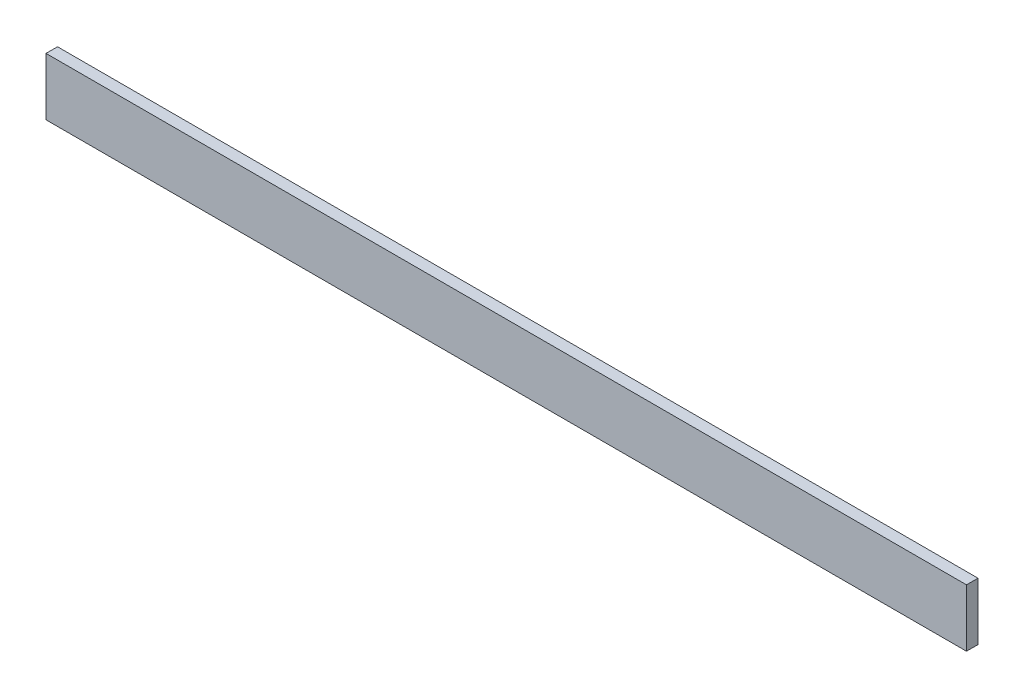
ISO-10303-21;
HEADER;
FILE_DESCRIPTION(('STEP AP214'),'2;1');
FILE_NAME('part.step','',(''),(''),'','','');
FILE_SCHEMA(('AUTOMOTIVE_DESIGN { 1 0 10303 214 1 1 1 1 }'));
ENDSEC;
DATA;
#1=APPLICATION_CONTEXT('core data for automotive mechanical design processes');
#2=APPLICATION_PROTOCOL_DEFINITION('international standard','automotive_design',2000,#1);
#3=PRODUCT_CONTEXT('',#1,'mechanical');
#4=PRODUCT('Part','Part','',(#3));
#5=PRODUCT_RELATED_PRODUCT_CATEGORY('part','',(#4));
#6=PRODUCT_DEFINITION_FORMATION('','',#4);
#7=PRODUCT_DEFINITION_CONTEXT('part definition',#1,'design');
#8=PRODUCT_DEFINITION('design','',#6,#7);
#9=PRODUCT_DEFINITION_SHAPE('','',#8);
#10=(LENGTH_UNIT() NAMED_UNIT(*) SI_UNIT(.MILLI.,.METRE.));
#11=(NAMED_UNIT(*) PLANE_ANGLE_UNIT() SI_UNIT($,.RADIAN.));
#12=(NAMED_UNIT(*) SI_UNIT($,.STERADIAN.) SOLID_ANGLE_UNIT());
#13=UNCERTAINTY_MEASURE_WITH_UNIT(LENGTH_MEASURE(1.E-05),#10,'distance_accuracy_value','');
#14=(GEOMETRIC_REPRESENTATION_CONTEXT(3) GLOBAL_UNCERTAINTY_ASSIGNED_CONTEXT((#13)) GLOBAL_UNIT_ASSIGNED_CONTEXT((#10,
#11,#12)) REPRESENTATION_CONTEXT('',''));
#15=CARTESIAN_POINT('',(0.,0.,0.));
#16=DIRECTION('',(0.,0.,1.));
#17=DIRECTION('',(1.,0.,0.));
#18=AXIS2_PLACEMENT_3D('',#15,#16,#17);
#19=CARTESIAN_POINT('',(-400.,-25.,10.));
#20=DIRECTION('',(1.,0.,0.));
#21=DIRECTION('',(0.,0.,-1.));
#22=AXIS2_PLACEMENT_3D('',#19,#20,#21);
#23=PLANE('',#22);
#24=DIRECTION('',(0.,-1.,0.));
#25=VECTOR('',#24,1.);
#26=CARTESIAN_POINT('',(-400.,-25.,0.));
#27=LINE('',#26,#25);
#28=CARTESIAN_POINT('',(-400.,25.,0.));
#29=VERTEX_POINT('',#28);
#30=CARTESIAN_POINT('',(-400.,-25.,0.));
#31=VERTEX_POINT('',#30);
#32=EDGE_CURVE('E109',#29,#31,#27,.T.);
#33=ORIENTED_EDGE('',*,*,#32,.T.);
#34=DIRECTION('',(0.,0.,-1.));
#35=VECTOR('',#34,1.);
#36=CARTESIAN_POINT('',(-400.,-25.,10.));
#37=LINE('',#36,#35);
#38=CARTESIAN_POINT('',(-400.,-25.,10.));
#39=VERTEX_POINT('',#38);
#40=EDGE_CURVE('E11',#39,#31,#37,.T.);
#41=ORIENTED_EDGE('',*,*,#40,.F.);
#42=DIRECTION('',(0.,-1.,0.));
#43=VECTOR('',#42,1.);
#44=CARTESIAN_POINT('',(-400.,-25.,10.));
#45=LINE('',#44,#43);
#46=CARTESIAN_POINT('',(-400.,25.,10.));
#47=VERTEX_POINT('',#46);
#48=EDGE_CURVE('E93',#47,#39,#45,.T.);
#49=ORIENTED_EDGE('',*,*,#48,.F.);
#50=DIRECTION('',(0.,0.,-1.));
#51=VECTOR('',#50,1.);
#52=CARTESIAN_POINT('',(-400.,25.,10.));
#53=LINE('',#52,#51);
#54=EDGE_CURVE('E105',#47,#29,#53,.T.);
#55=ORIENTED_EDGE('',*,*,#54,.T.);
#56=EDGE_LOOP('',(#33,#41,#49,#55));
#57=FACE_BOUND('',#56,.T.);
#58=ADVANCED_FACE('F41',(#57),#23,.F.);
#59=CARTESIAN_POINT('',(400.,-25.,10.));
#60=DIRECTION('',(0.,1.,0.));
#61=DIRECTION('',(-1.,0.,0.));
#62=AXIS2_PLACEMENT_3D('',#59,#60,#61);
#63=PLANE('',#62);
#64=DIRECTION('',(1.,0.,0.));
#65=VECTOR('',#64,1.);
#66=CARTESIAN_POINT('',(400.,-25.,0.));
#67=LINE('',#66,#65);
#68=CARTESIAN_POINT('',(400.,-25.,0.));
#69=VERTEX_POINT('',#68);
#70=EDGE_CURVE('E98',#31,#69,#67,.T.);
#71=ORIENTED_EDGE('',*,*,#70,.T.);
#72=DIRECTION('',(0.,0.,-1.));
#73=VECTOR('',#72,1.);
#74=CARTESIAN_POINT('',(400.,-25.,10.));
#75=LINE('',#74,#73);
#76=CARTESIAN_POINT('',(400.,-25.,10.));
#77=VERTEX_POINT('',#76);
#78=EDGE_CURVE('E50',#77,#69,#75,.T.);
#79=ORIENTED_EDGE('',*,*,#78,.F.);
#80=DIRECTION('',(1.,0.,0.));
#81=VECTOR('',#80,1.);
#82=CARTESIAN_POINT('',(400.,-25.,10.));
#83=LINE('',#82,#81);
#84=EDGE_CURVE('E88',#39,#77,#83,.T.);
#85=ORIENTED_EDGE('',*,*,#84,.F.);
#86=ORIENTED_EDGE('',*,*,#40,.T.);
#87=EDGE_LOOP('',(#71,#79,#85,#86));
#88=FACE_BOUND('',#87,.T.);
#89=ADVANCED_FACE('F97',(#88),#63,.F.);
#90=CARTESIAN_POINT('',(400.,-25.,10.));
#91=DIRECTION('',(-1.,0.,0.));
#92=DIRECTION('',(0.,0.,1.));
#93=AXIS2_PLACEMENT_3D('',#90,#91,#92);
#94=PLANE('',#93);
#95=DIRECTION('',(0.,1.,0.));
#96=VECTOR('',#95,1.);
#97=CARTESIAN_POINT('',(400.,-25.,0.));
#98=LINE('',#97,#96);
#99=CARTESIAN_POINT('',(400.,25.0000000000001,0.));
#100=VERTEX_POINT('',#99);
#101=EDGE_CURVE('E75',#69,#100,#98,.T.);
#102=ORIENTED_EDGE('',*,*,#101,.T.);
#103=DIRECTION('',(0.,0.,-1.));
#104=VECTOR('',#103,1.);
#105=CARTESIAN_POINT('',(400.,25.0000000000001,10.));
#106=LINE('',#105,#104);
#107=CARTESIAN_POINT('',(400.,25.0000000000001,10.));
#108=VERTEX_POINT('',#107);
#109=EDGE_CURVE('E100',#108,#100,#106,.T.);
#110=ORIENTED_EDGE('',*,*,#109,.F.);
#111=DIRECTION('',(0.,1.,0.));
#112=VECTOR('',#111,1.);
#113=CARTESIAN_POINT('',(400.,-25.,10.));
#114=LINE('',#113,#112);
#115=EDGE_CURVE('E91',#77,#108,#114,.T.);
#116=ORIENTED_EDGE('',*,*,#115,.F.);
#117=ORIENTED_EDGE('',*,*,#78,.T.);
#118=EDGE_LOOP('',(#102,#110,#116,#117));
#119=FACE_BOUND('',#118,.T.);
#120=ADVANCED_FACE('F101',(#119),#94,.F.);
#121=CARTESIAN_POINT('',(400.,25.0000000000001,10.));
#122=DIRECTION('',(0.,-1.,0.));
#123=DIRECTION('',(1.,0.,0.));
#124=AXIS2_PLACEMENT_3D('',#121,#122,#123);
#125=PLANE('',#124);
#126=DIRECTION('',(-1.,0.,0.));
#127=VECTOR('',#126,1.);
#128=CARTESIAN_POINT('',(400.,25.0000000000001,0.));
#129=LINE('',#128,#127);
#130=EDGE_CURVE('E81',#100,#29,#129,.T.);
#131=ORIENTED_EDGE('',*,*,#130,.T.);
#132=ORIENTED_EDGE('',*,*,#54,.F.);
#133=DIRECTION('',(-1.,0.,0.));
#134=VECTOR('',#133,1.);
#135=CARTESIAN_POINT('',(400.,25.0000000000001,10.));
#136=LINE('',#135,#134);
#137=EDGE_CURVE('E58',#108,#47,#136,.T.);
#138=ORIENTED_EDGE('',*,*,#137,.F.);
#139=ORIENTED_EDGE('',*,*,#109,.T.);
#140=EDGE_LOOP('',(#131,#132,#138,#139));
#141=FACE_BOUND('',#140,.T.);
#142=ADVANCED_FACE('F122',(#141),#125,.F.);
#143=CARTESIAN_POINT('',(0.,0.,10.));
#144=DIRECTION('',(0.,0.,1.));
#145=DIRECTION('',(1.,0.,0.));
#146=AXIS2_PLACEMENT_3D('',#143,#144,#145);
#147=PLANE('',#146);
#148=ORIENTED_EDGE('',*,*,#48,.T.);
#149=ORIENTED_EDGE('',*,*,#84,.T.);
#150=ORIENTED_EDGE('',*,*,#115,.T.);
#151=ORIENTED_EDGE('',*,*,#137,.T.);
#152=EDGE_LOOP('',(#148,#149,#150,#151));
#153=FACE_BOUND('',#152,.T.);
#154=ADVANCED_FACE('F89',(#153),#147,.T.);
#155=CARTESIAN_POINT('',(0.,0.,0.));
#156=DIRECTION('',(0.,0.,1.));
#157=DIRECTION('',(1.,0.,0.));
#158=AXIS2_PLACEMENT_3D('',#155,#156,#157);
#159=PLANE('',#158);
#160=ORIENTED_EDGE('',*,*,#32,.F.);
#161=ORIENTED_EDGE('',*,*,#130,.F.);
#162=ORIENTED_EDGE('',*,*,#101,.F.);
#163=ORIENTED_EDGE('',*,*,#70,.F.);
#164=EDGE_LOOP('',(#160,#161,#162,#163));
#165=FACE_BOUND('',#164,.T.);
#166=ADVANCED_FACE('F125',(#165),#159,.F.);
#167=CLOSED_SHELL('',(#58,#89,#120,#142,#154,#166));
#168=MANIFOLD_SOLID_BREP('B2',#167);
#169=ADVANCED_BREP_SHAPE_REPRESENTATION('',(#18,#168),#14);
#170=SHAPE_DEFINITION_REPRESENTATION(#9,#169);
ENDSEC;
END-ISO-10303-21;
